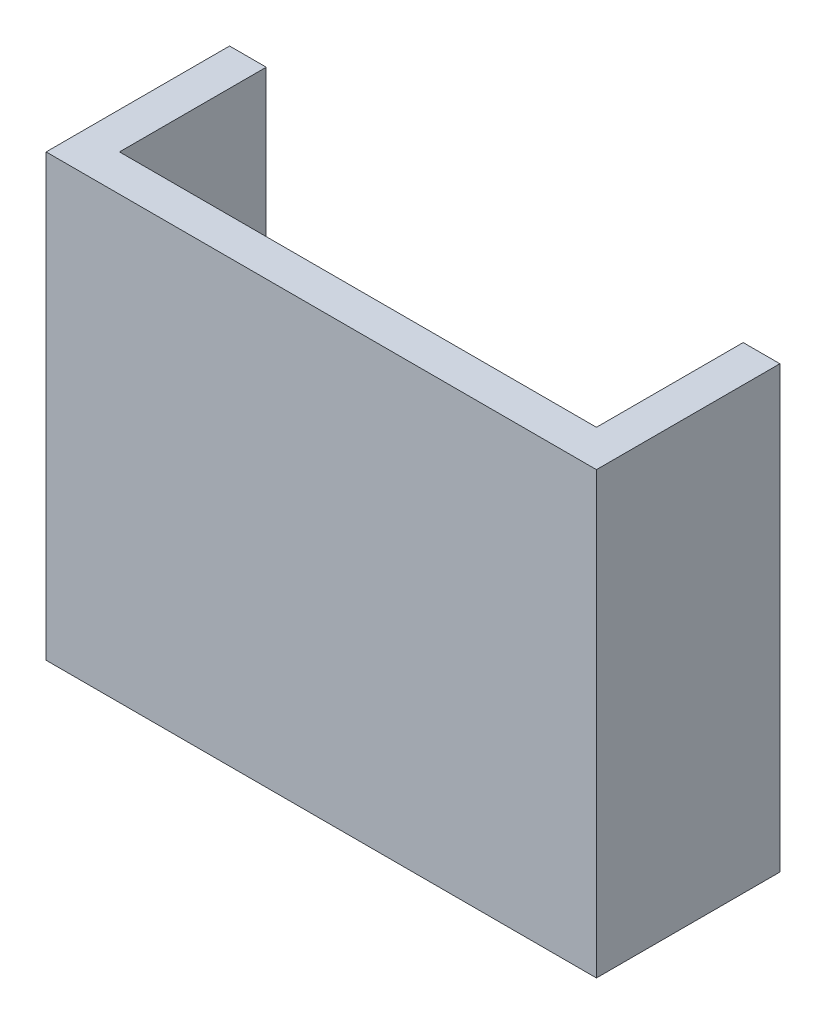
ISO-10303-21;
HEADER;
FILE_DESCRIPTION(('STEP AP214'),'2;1');
FILE_NAME('part.step','',(''),(''),'','','');
FILE_SCHEMA(('AUTOMOTIVE_DESIGN { 1 0 10303 214 1 1 1 1 }'));
ENDSEC;
DATA;
#1=APPLICATION_CONTEXT('core data for automotive mechanical design processes');
#2=APPLICATION_PROTOCOL_DEFINITION('international standard','automotive_design',2000,#1);
#3=PRODUCT_CONTEXT('',#1,'mechanical');
#4=PRODUCT('Part','Part','',(#3));
#5=PRODUCT_RELATED_PRODUCT_CATEGORY('part','',(#4));
#6=PRODUCT_DEFINITION_FORMATION('','',#4);
#7=PRODUCT_DEFINITION_CONTEXT('part definition',#1,'design');
#8=PRODUCT_DEFINITION('design','',#6,#7);
#9=PRODUCT_DEFINITION_SHAPE('','',#8);
#10=(LENGTH_UNIT() NAMED_UNIT(*) SI_UNIT(.MILLI.,.METRE.));
#11=(NAMED_UNIT(*) PLANE_ANGLE_UNIT() SI_UNIT($,.RADIAN.));
#12=(NAMED_UNIT(*) SI_UNIT($,.STERADIAN.) SOLID_ANGLE_UNIT());
#13=UNCERTAINTY_MEASURE_WITH_UNIT(LENGTH_MEASURE(1.E-05),#10,'distance_accuracy_value','');
#14=(GEOMETRIC_REPRESENTATION_CONTEXT(3) GLOBAL_UNCERTAINTY_ASSIGNED_CONTEXT((#13)) GLOBAL_UNIT_ASSIGNED_CONTEXT((#10,
#11,#12)) REPRESENTATION_CONTEXT('',''));
#15=CARTESIAN_POINT('',(0.,0.,0.));
#16=DIRECTION('',(0.,0.,1.));
#17=DIRECTION('',(1.,0.,0.));
#18=AXIS2_PLACEMENT_3D('',#15,#16,#17);
#19=CARTESIAN_POINT('',(0.,0.,0.));
#20=DIRECTION('',(0.,0.,1.));
#21=DIRECTION('',(1.,0.,0.));
#22=AXIS2_PLACEMENT_3D('',#19,#20,#21);
#23=PLANE('',#22);
#24=DIRECTION('',(-1.,0.,0.));
#25=VECTOR('',#24,1.);
#26=CARTESIAN_POINT('',(-30.,24.,0.));
#27=LINE('',#26,#25);
#28=CARTESIAN_POINT('',(-28.,24.,0.));
#29=VERTEX_POINT('',#28);
#30=CARTESIAN_POINT('',(-30.,24.,0.));
#31=VERTEX_POINT('',#30);
#32=EDGE_CURVE('E78',#29,#31,#27,.T.);
#33=ORIENTED_EDGE('',*,*,#32,.F.);
#34=DIRECTION('',(0.,1.,0.));
#35=VECTOR('',#34,1.);
#36=CARTESIAN_POINT('',(-28.,24.,0.));
#37=LINE('',#36,#35);
#38=CARTESIAN_POINT('',(-28.,0.,0.));
#39=VERTEX_POINT('',#38);
#40=EDGE_CURVE('E111',#39,#29,#37,.T.);
#41=ORIENTED_EDGE('',*,*,#40,.F.);
#42=DIRECTION('',(1.,0.,0.));
#43=VECTOR('',#42,1.);
#44=CARTESIAN_POINT('',(-30.,0.,0.));
#45=LINE('',#44,#43);
#46=CARTESIAN_POINT('',(-30.,0.,0.));
#47=VERTEX_POINT('',#46);
#48=EDGE_CURVE('E151',#47,#39,#45,.T.);
#49=ORIENTED_EDGE('',*,*,#48,.F.);
#50=DIRECTION('',(0.,-1.,0.));
#51=VECTOR('',#50,1.);
#52=CARTESIAN_POINT('',(-30.,24.,0.));
#53=LINE('',#52,#51);
#54=EDGE_CURVE('E135',#31,#47,#53,.T.);
#55=ORIENTED_EDGE('',*,*,#54,.F.);
#56=EDGE_LOOP('',(#33,#41,#49,#55));
#57=FACE_BOUND('',#56,.T.);
#58=ADVANCED_FACE('F33',(#57),#23,.F.);
#59=CARTESIAN_POINT('',(-30.,24.,10.));
#60=DIRECTION('',(1.,0.,0.));
#61=DIRECTION('',(0.,0.,-1.));
#62=AXIS2_PLACEMENT_3D('',#59,#60,#61);
#63=PLANE('',#62);
#64=ORIENTED_EDGE('',*,*,#54,.T.);
#65=DIRECTION('',(0.,0.,-1.));
#66=VECTOR('',#65,1.);
#67=CARTESIAN_POINT('',(-30.,0.,10.));
#68=LINE('',#67,#66);
#69=CARTESIAN_POINT('',(-30.,0.,10.));
#70=VERTEX_POINT('',#69);
#71=EDGE_CURVE('E11',#70,#47,#68,.T.);
#72=ORIENTED_EDGE('',*,*,#71,.F.);
#73=DIRECTION('',(0.,-1.,0.));
#74=VECTOR('',#73,1.);
#75=CARTESIAN_POINT('',(-30.,24.,10.));
#76=LINE('',#75,#74);
#77=CARTESIAN_POINT('',(-30.,24.,10.));
#78=VERTEX_POINT('',#77);
#79=EDGE_CURVE('E140',#78,#70,#76,.T.);
#80=ORIENTED_EDGE('',*,*,#79,.F.);
#81=DIRECTION('',(0.,0.,-1.));
#82=VECTOR('',#81,1.);
#83=CARTESIAN_POINT('',(-30.,24.,10.));
#84=LINE('',#83,#82);
#85=EDGE_CURVE('E147',#78,#31,#84,.T.);
#86=ORIENTED_EDGE('',*,*,#85,.T.);
#87=EDGE_LOOP('',(#64,#72,#80,#86));
#88=FACE_BOUND('',#87,.T.);
#89=ADVANCED_FACE('F35',(#88),#63,.F.);
#90=CARTESIAN_POINT('',(-30.,0.,10.));
#91=DIRECTION('',(0.,1.,0.));
#92=DIRECTION('',(0.,0.,1.));
#93=AXIS2_PLACEMENT_3D('',#90,#91,#92);
#94=PLANE('',#93);
#95=ORIENTED_EDGE('',*,*,#48,.T.);
#96=DIRECTION('',(0.,0.,-1.));
#97=VECTOR('',#96,1.);
#98=CARTESIAN_POINT('',(-28.,0.,8.));
#99=LINE('',#98,#97);
#100=CARTESIAN_POINT('',(-28.,0.,8.));
#101=VERTEX_POINT('',#100);
#102=EDGE_CURVE('E133',#101,#39,#99,.T.);
#103=ORIENTED_EDGE('',*,*,#102,.F.);
#104=DIRECTION('',(-1.,0.,0.));
#105=VECTOR('',#104,1.);
#106=CARTESIAN_POINT('',(-28.,0.,8.));
#107=LINE('',#106,#105);
#108=CARTESIAN_POINT('',(-2.00000000000001,0.,8.));
#109=VERTEX_POINT('',#108);
#110=EDGE_CURVE('E113',#109,#101,#107,.T.);
#111=ORIENTED_EDGE('',*,*,#110,.F.);
#112=DIRECTION('',(0.,0.,-1.));
#113=VECTOR('',#112,1.);
#114=CARTESIAN_POINT('',(-2.00000000000001,0.,8.));
#115=LINE('',#114,#113);
#116=CARTESIAN_POINT('',(-2.00000000000001,0.,0.));
#117=VERTEX_POINT('',#116);
#118=EDGE_CURVE('E136',#109,#117,#115,.T.);
#119=ORIENTED_EDGE('',*,*,#118,.T.);
#120=CARTESIAN_POINT('',(0.,0.,0.));
#121=VERTEX_POINT('',#120);
#122=EDGE_CURVE('E150',#117,#121,#45,.T.);
#123=ORIENTED_EDGE('',*,*,#122,.T.);
#124=DIRECTION('',(0.,0.,-1.));
#125=VECTOR('',#124,1.);
#126=CARTESIAN_POINT('',(0.,0.,10.));
#127=LINE('',#126,#125);
#128=CARTESIAN_POINT('',(0.,0.,10.));
#129=VERTEX_POINT('',#128);
#130=EDGE_CURVE('E41',#129,#121,#127,.T.);
#131=ORIENTED_EDGE('',*,*,#130,.F.);
#132=DIRECTION('',(1.,0.,0.));
#133=VECTOR('',#132,1.);
#134=CARTESIAN_POINT('',(-30.,0.,10.));
#135=LINE('',#134,#133);
#136=EDGE_CURVE('E85',#70,#129,#135,.T.);
#137=ORIENTED_EDGE('',*,*,#136,.F.);
#138=ORIENTED_EDGE('',*,*,#71,.T.);
#139=EDGE_LOOP('',(#95,#103,#111,#119,#123,#131,#137,#138));
#140=FACE_BOUND('',#139,.T.);
#141=ADVANCED_FACE('F189',(#140),#94,.F.);
#142=CARTESIAN_POINT('',(0.,24.,10.));
#143=DIRECTION('',(-1.,0.,0.));
#144=DIRECTION('',(0.,-1.,0.));
#145=AXIS2_PLACEMENT_3D('',#142,#143,#144);
#146=PLANE('',#145);
#147=DIRECTION('',(0.,1.,0.));
#148=VECTOR('',#147,1.);
#149=CARTESIAN_POINT('',(0.,24.,0.));
#150=LINE('',#149,#148);
#151=CARTESIAN_POINT('',(0.,24.,0.));
#152=VERTEX_POINT('',#151);
#153=EDGE_CURVE('E154',#121,#152,#150,.T.);
#154=ORIENTED_EDGE('',*,*,#153,.T.);
#155=DIRECTION('',(0.,0.,-1.));
#156=VECTOR('',#155,1.);
#157=CARTESIAN_POINT('',(0.,24.,10.));
#158=LINE('',#157,#156);
#159=CARTESIAN_POINT('',(0.,24.,10.));
#160=VERTEX_POINT('',#159);
#161=EDGE_CURVE('E158',#160,#152,#158,.T.);
#162=ORIENTED_EDGE('',*,*,#161,.F.);
#163=DIRECTION('',(0.,1.,0.));
#164=VECTOR('',#163,1.);
#165=CARTESIAN_POINT('',(0.,24.,10.));
#166=LINE('',#165,#164);
#167=EDGE_CURVE('E144',#129,#160,#166,.T.);
#168=ORIENTED_EDGE('',*,*,#167,.F.);
#169=ORIENTED_EDGE('',*,*,#130,.T.);
#170=EDGE_LOOP('',(#154,#162,#168,#169));
#171=FACE_BOUND('',#170,.T.);
#172=ADVANCED_FACE('F164',(#171),#146,.F.);
#173=CARTESIAN_POINT('',(-30.,24.,10.));
#174=DIRECTION('',(0.,-1.,0.));
#175=DIRECTION('',(0.,0.,-1.));
#176=AXIS2_PLACEMENT_3D('',#173,#174,#175);
#177=PLANE('',#176);
#178=DIRECTION('',(1.,0.,0.));
#179=VECTOR('',#178,1.);
#180=CARTESIAN_POINT('',(-28.,24.,8.));
#181=LINE('',#180,#179);
#182=CARTESIAN_POINT('',(-28.,24.,8.));
#183=VERTEX_POINT('',#182);
#184=CARTESIAN_POINT('',(-2.,24.,8.));
#185=VERTEX_POINT('',#184);
#186=EDGE_CURVE('E119',#183,#185,#181,.T.);
#187=ORIENTED_EDGE('',*,*,#186,.F.);
#188=DIRECTION('',(0.,0.,-1.));
#189=VECTOR('',#188,1.);
#190=CARTESIAN_POINT('',(-28.,24.,8.));
#191=LINE('',#190,#189);
#192=EDGE_CURVE('E105',#183,#29,#191,.T.);
#193=ORIENTED_EDGE('',*,*,#192,.T.);
#194=ORIENTED_EDGE('',*,*,#32,.T.);
#195=ORIENTED_EDGE('',*,*,#85,.F.);
#196=DIRECTION('',(-1.,0.,0.));
#197=VECTOR('',#196,1.);
#198=CARTESIAN_POINT('',(-30.,24.,10.));
#199=LINE('',#198,#197);
#200=EDGE_CURVE('E57',#160,#78,#199,.T.);
#201=ORIENTED_EDGE('',*,*,#200,.F.);
#202=ORIENTED_EDGE('',*,*,#161,.T.);
#203=CARTESIAN_POINT('',(-2.,24.,0.));
#204=VERTEX_POINT('',#203);
#205=EDGE_CURVE('E142',#152,#204,#27,.T.);
#206=ORIENTED_EDGE('',*,*,#205,.T.);
#207=DIRECTION('',(0.,0.,-1.));
#208=VECTOR('',#207,1.);
#209=CARTESIAN_POINT('',(-2.,24.,8.));
#210=LINE('',#209,#208);
#211=EDGE_CURVE('E48',#185,#204,#210,.T.);
#212=ORIENTED_EDGE('',*,*,#211,.F.);
#213=EDGE_LOOP('',(#187,#193,#194,#195,#201,#202,#206,#212));
#214=FACE_BOUND('',#213,.T.);
#215=ADVANCED_FACE('F124',(#214),#177,.F.);
#216=CARTESIAN_POINT('',(0.,0.,10.));
#217=DIRECTION('',(0.,0.,1.));
#218=DIRECTION('',(1.,0.,0.));
#219=AXIS2_PLACEMENT_3D('',#216,#217,#218);
#220=PLANE('',#219);
#221=ORIENTED_EDGE('',*,*,#79,.T.);
#222=ORIENTED_EDGE('',*,*,#136,.T.);
#223=ORIENTED_EDGE('',*,*,#167,.T.);
#224=ORIENTED_EDGE('',*,*,#200,.T.);
#225=EDGE_LOOP('',(#221,#222,#223,#224));
#226=FACE_BOUND('',#225,.T.);
#227=ADVANCED_FACE('F174',(#226),#220,.T.);
#228=ORIENTED_EDGE('',*,*,#122,.F.);
#229=DIRECTION('',(0.,-1.,0.));
#230=VECTOR('',#229,1.);
#231=CARTESIAN_POINT('',(-2.,24.,0.));
#232=LINE('',#231,#230);
#233=EDGE_CURVE('E122',#204,#117,#232,.T.);
#234=ORIENTED_EDGE('',*,*,#233,.F.);
#235=ORIENTED_EDGE('',*,*,#205,.F.);
#236=ORIENTED_EDGE('',*,*,#153,.F.);
#237=EDGE_LOOP('',(#228,#234,#235,#236));
#238=FACE_BOUND('',#237,.T.);
#239=ADVANCED_FACE('F169',(#238),#23,.F.);
#240=CARTESIAN_POINT('',(-28.,24.,8.));
#241=DIRECTION('',(-1.,0.,0.));
#242=DIRECTION('',(0.,-1.,0.));
#243=AXIS2_PLACEMENT_3D('',#240,#241,#242);
#244=PLANE('',#243);
#245=ORIENTED_EDGE('',*,*,#40,.T.);
#246=ORIENTED_EDGE('',*,*,#192,.F.);
#247=DIRECTION('',(0.,1.,0.));
#248=VECTOR('',#247,1.);
#249=CARTESIAN_POINT('',(-28.,24.,8.));
#250=LINE('',#249,#248);
#251=EDGE_CURVE('E108',#101,#183,#250,.T.);
#252=ORIENTED_EDGE('',*,*,#251,.F.);
#253=ORIENTED_EDGE('',*,*,#102,.T.);
#254=EDGE_LOOP('',(#245,#246,#252,#253));
#255=FACE_BOUND('',#254,.T.);
#256=ADVANCED_FACE('F107',(#255),#244,.F.);
#257=CARTESIAN_POINT('',(-2.,24.,8.));
#258=DIRECTION('',(1.,0.,0.));
#259=DIRECTION('',(0.,1.,0.));
#260=AXIS2_PLACEMENT_3D('',#257,#258,#259);
#261=PLANE('',#260);
#262=ORIENTED_EDGE('',*,*,#233,.T.);
#263=ORIENTED_EDGE('',*,*,#118,.F.);
#264=DIRECTION('',(0.,-1.,0.));
#265=VECTOR('',#264,1.);
#266=CARTESIAN_POINT('',(-2.,24.,8.));
#267=LINE('',#266,#265);
#268=EDGE_CURVE('E126',#185,#109,#267,.T.);
#269=ORIENTED_EDGE('',*,*,#268,.F.);
#270=ORIENTED_EDGE('',*,*,#211,.T.);
#271=EDGE_LOOP('',(#262,#263,#269,#270));
#272=FACE_BOUND('',#271,.T.);
#273=ADVANCED_FACE('F195',(#272),#261,.F.);
#274=CARTESIAN_POINT('',(0.,0.,8.));
#275=DIRECTION('',(0.,0.,1.));
#276=DIRECTION('',(1.,0.,0.));
#277=AXIS2_PLACEMENT_3D('',#274,#275,#276);
#278=PLANE('',#277);
#279=ORIENTED_EDGE('',*,*,#251,.T.);
#280=ORIENTED_EDGE('',*,*,#186,.T.);
#281=ORIENTED_EDGE('',*,*,#268,.T.);
#282=ORIENTED_EDGE('',*,*,#110,.T.);
#283=EDGE_LOOP('',(#279,#280,#281,#282));
#284=FACE_BOUND('',#283,.T.);
#285=ADVANCED_FACE('F117',(#284),#278,.F.);
#286=CLOSED_SHELL('',(#58,#89,#141,#172,#215,#227,#239,#256,#273,#285));
#287=MANIFOLD_SOLID_BREP('B2',#286);
#288=ADVANCED_BREP_SHAPE_REPRESENTATION('',(#18,#287),#14);
#289=SHAPE_DEFINITION_REPRESENTATION(#9,#288);
ENDSEC;
END-ISO-10303-21;
